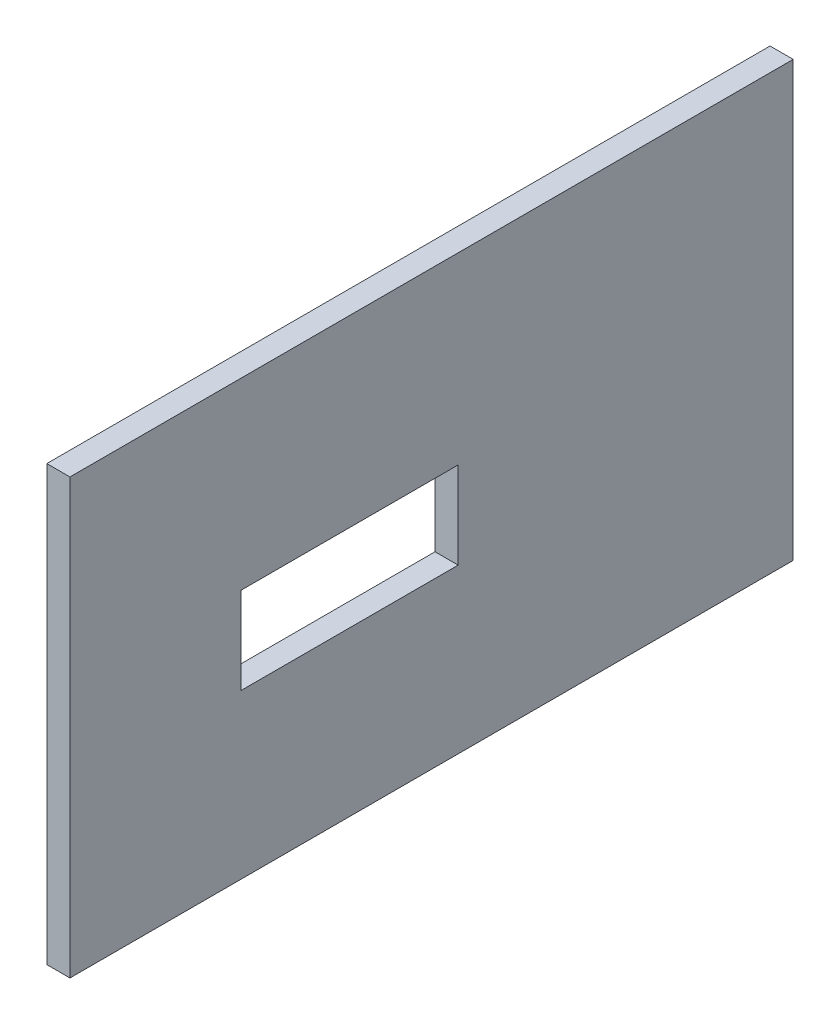
ISO-10303-21;
HEADER;
FILE_DESCRIPTION(('STEP AP214'),'2;1');
FILE_NAME('part.step','',(''),(''),'','','');
FILE_SCHEMA(('AUTOMOTIVE_DESIGN { 1 0 10303 214 1 1 1 1 }'));
ENDSEC;
DATA;
#1=APPLICATION_CONTEXT('core data for automotive mechanical design processes');
#2=APPLICATION_PROTOCOL_DEFINITION('international standard','automotive_design',2000,#1);
#3=PRODUCT_CONTEXT('',#1,'mechanical');
#4=PRODUCT('Part','Part','',(#3));
#5=PRODUCT_RELATED_PRODUCT_CATEGORY('part','',(#4));
#6=PRODUCT_DEFINITION_FORMATION('','',#4);
#7=PRODUCT_DEFINITION_CONTEXT('part definition',#1,'design');
#8=PRODUCT_DEFINITION('design','',#6,#7);
#9=PRODUCT_DEFINITION_SHAPE('','',#8);
#10=(LENGTH_UNIT() NAMED_UNIT(*) SI_UNIT(.MILLI.,.METRE.));
#11=(NAMED_UNIT(*) PLANE_ANGLE_UNIT() SI_UNIT($,.RADIAN.));
#12=(NAMED_UNIT(*) SI_UNIT($,.STERADIAN.) SOLID_ANGLE_UNIT());
#13=UNCERTAINTY_MEASURE_WITH_UNIT(LENGTH_MEASURE(1.E-05),#10,'distance_accuracy_value','');
#14=(GEOMETRIC_REPRESENTATION_CONTEXT(3) GLOBAL_UNCERTAINTY_ASSIGNED_CONTEXT((#13)) GLOBAL_UNIT_ASSIGNED_CONTEXT((#10,
#11,#12)) REPRESENTATION_CONTEXT('',''));
#15=CARTESIAN_POINT('',(0.,0.,0.));
#16=DIRECTION('',(0.,0.,1.));
#17=DIRECTION('',(1.,0.,0.));
#18=AXIS2_PLACEMENT_3D('',#15,#16,#17);
#19=CARTESIAN_POINT('',(3.2,37.4000000000006,1.06355163924267));
#20=DIRECTION('',(0.,0.,1.));
#21=DIRECTION('',(0.,-1.,0.));
#22=AXIS2_PLACEMENT_3D('',#19,#20,#21);
#23=PLANE('',#22);
#24=DIRECTION('',(0.,1.,0.));
#25=VECTOR('',#24,1.);
#26=CARTESIAN_POINT('',(0.,37.4000000000006,1.06355163924267));
#27=LINE('',#26,#25);
#28=CARTESIAN_POINT('',(0.,-22.5999999999994,1.06355163924265));
#29=VERTEX_POINT('',#28);
#30=CARTESIAN_POINT('',(0.,37.4000000000006,1.06355163924267));
#31=VERTEX_POINT('',#30);
#32=EDGE_CURVE('E133',#29,#31,#27,.T.);
#33=ORIENTED_EDGE('',*,*,#32,.T.);
#34=DIRECTION('',(-1.,0.,0.));
#35=VECTOR('',#34,1.);
#36=CARTESIAN_POINT('',(3.2,37.4000000000006,1.06355163924267));
#37=LINE('',#36,#35);
#38=CARTESIAN_POINT('',(3.2,37.4000000000006,1.06355163924267));
#39=VERTEX_POINT('',#38);
#40=EDGE_CURVE('E11',#39,#31,#37,.T.);
#41=ORIENTED_EDGE('',*,*,#40,.F.);
#42=DIRECTION('',(0.,1.,0.));
#43=VECTOR('',#42,1.);
#44=CARTESIAN_POINT('',(3.2,37.4000000000006,1.06355163924267));
#45=LINE('',#44,#43);
#46=CARTESIAN_POINT('',(3.2,-22.5999999999994,1.06355163924265));
#47=VERTEX_POINT('',#46);
#48=EDGE_CURVE('E137',#47,#39,#45,.T.);
#49=ORIENTED_EDGE('',*,*,#48,.F.);
#50=DIRECTION('',(-1.,0.,0.));
#51=VECTOR('',#50,1.);
#52=CARTESIAN_POINT('',(3.2,-22.5999999999994,1.06355163924265));
#53=LINE('',#52,#51);
#54=EDGE_CURVE('E147',#47,#29,#53,.T.);
#55=ORIENTED_EDGE('',*,*,#54,.T.);
#56=EDGE_LOOP('',(#33,#41,#49,#55));
#57=FACE_BOUND('',#56,.T.);
#58=ADVANCED_FACE('F36',(#57),#23,.F.);
#59=CARTESIAN_POINT('',(3.2,37.4000000000006,101.063551639243));
#60=DIRECTION('',(0.,-1.,0.));
#61=DIRECTION('',(0.,0.,-1.));
#62=AXIS2_PLACEMENT_3D('',#59,#60,#61);
#63=PLANE('',#62);
#64=DIRECTION('',(0.,0.,1.));
#65=VECTOR('',#64,1.);
#66=CARTESIAN_POINT('',(0.,37.4000000000006,101.063551639243));
#67=LINE('',#66,#65);
#68=CARTESIAN_POINT('',(0.,37.4000000000006,101.063551639243));
#69=VERTEX_POINT('',#68);
#70=EDGE_CURVE('E150',#31,#69,#67,.T.);
#71=ORIENTED_EDGE('',*,*,#70,.T.);
#72=DIRECTION('',(-1.,0.,0.));
#73=VECTOR('',#72,1.);
#74=CARTESIAN_POINT('',(3.2,37.4000000000006,101.063551639243));
#75=LINE('',#74,#73);
#76=CARTESIAN_POINT('',(3.2,37.4000000000006,101.063551639243));
#77=VERTEX_POINT('',#76);
#78=EDGE_CURVE('E43',#77,#69,#75,.T.);
#79=ORIENTED_EDGE('',*,*,#78,.F.);
#80=DIRECTION('',(0.,0.,1.));
#81=VECTOR('',#80,1.);
#82=CARTESIAN_POINT('',(3.2,37.4000000000006,101.063551639243));
#83=LINE('',#82,#81);
#84=EDGE_CURVE('E140',#39,#77,#83,.T.);
#85=ORIENTED_EDGE('',*,*,#84,.F.);
#86=ORIENTED_EDGE('',*,*,#40,.T.);
#87=EDGE_LOOP('',(#71,#79,#85,#86));
#88=FACE_BOUND('',#87,.T.);
#89=ADVANCED_FACE('F178',(#88),#63,.F.);
#90=CARTESIAN_POINT('',(3.2,37.4000000000006,101.063551639243));
#91=DIRECTION('',(0.,0.,-1.));
#92=DIRECTION('',(0.,1.,0.));
#93=AXIS2_PLACEMENT_3D('',#90,#91,#92);
#94=PLANE('',#93);
#95=DIRECTION('',(0.,-1.,0.));
#96=VECTOR('',#95,1.);
#97=CARTESIAN_POINT('',(0.,37.4000000000006,101.063551639243));
#98=LINE('',#97,#96);
#99=CARTESIAN_POINT('',(0.,-22.5999999999994,101.063551639243));
#100=VERTEX_POINT('',#99);
#101=EDGE_CURVE('E152',#69,#100,#98,.T.);
#102=ORIENTED_EDGE('',*,*,#101,.T.);
#103=DIRECTION('',(-1.,0.,0.));
#104=VECTOR('',#103,1.);
#105=CARTESIAN_POINT('',(3.2,-22.5999999999994,101.063551639243));
#106=LINE('',#105,#104);
#107=CARTESIAN_POINT('',(3.2,-22.5999999999994,101.063551639243));
#108=VERTEX_POINT('',#107);
#109=EDGE_CURVE('E157',#108,#100,#106,.T.);
#110=ORIENTED_EDGE('',*,*,#109,.F.);
#111=DIRECTION('',(0.,-1.,0.));
#112=VECTOR('',#111,1.);
#113=CARTESIAN_POINT('',(3.2,37.4000000000006,101.063551639243));
#114=LINE('',#113,#112);
#115=EDGE_CURVE('E143',#77,#108,#114,.T.);
#116=ORIENTED_EDGE('',*,*,#115,.F.);
#117=ORIENTED_EDGE('',*,*,#78,.T.);
#118=EDGE_LOOP('',(#102,#110,#116,#117));
#119=FACE_BOUND('',#118,.T.);
#120=ADVANCED_FACE('F164',(#119),#94,.F.);
#121=CARTESIAN_POINT('',(3.2,-22.5999999999994,101.063551639243));
#122=DIRECTION('',(0.,1.,0.));
#123=DIRECTION('',(0.,0.,1.));
#124=AXIS2_PLACEMENT_3D('',#121,#122,#123);
#125=PLANE('',#124);
#126=DIRECTION('',(0.,0.,-1.));
#127=VECTOR('',#126,1.);
#128=CARTESIAN_POINT('',(0.,-22.5999999999994,101.063551639243));
#129=LINE('',#128,#127);
#130=EDGE_CURVE('E141',#100,#29,#129,.T.);
#131=ORIENTED_EDGE('',*,*,#130,.T.);
#132=ORIENTED_EDGE('',*,*,#54,.F.);
#133=DIRECTION('',(0.,0.,-1.));
#134=VECTOR('',#133,1.);
#135=CARTESIAN_POINT('',(3.2,-22.5999999999994,101.063551639243));
#136=LINE('',#135,#134);
#137=EDGE_CURVE('E145',#108,#47,#136,.T.);
#138=ORIENTED_EDGE('',*,*,#137,.F.);
#139=ORIENTED_EDGE('',*,*,#109,.T.);
#140=EDGE_LOOP('',(#131,#132,#138,#139));
#141=FACE_BOUND('',#140,.T.);
#142=ADVANCED_FACE('F171',(#141),#125,.F.);
#143=CARTESIAN_POINT('',(3.2,0.,0.));
#144=DIRECTION('',(1.,0.,0.));
#145=DIRECTION('',(0.,0.,-1.));
#146=AXIS2_PLACEMENT_3D('',#143,#144,#145);
#147=PLANE('',#146);
#148=DIRECTION('',(0.,1.,0.));
#149=VECTOR('',#148,1.);
#150=CARTESIAN_POINT('',(3.2,12.,47.3877220991028));
#151=LINE('',#150,#149);
#152=CARTESIAN_POINT('',(3.2,0.,47.3877220991028));
#153=VERTEX_POINT('',#152);
#154=CARTESIAN_POINT('',(3.2,12.,47.3877220991028));
#155=VERTEX_POINT('',#154);
#156=EDGE_CURVE('E50',#153,#155,#151,.T.);
#157=ORIENTED_EDGE('',*,*,#156,.F.);
#158=DIRECTION('',(0.,0.,-1.));
#159=VECTOR('',#158,1.);
#160=CARTESIAN_POINT('',(3.2,0.,77.3877220991028));
#161=LINE('',#160,#159);
#162=CARTESIAN_POINT('',(3.2,0.,77.3877220991028));
#163=VERTEX_POINT('',#162);
#164=EDGE_CURVE('E118',#163,#153,#161,.T.);
#165=ORIENTED_EDGE('',*,*,#164,.F.);
#166=DIRECTION('',(0.,-1.,0.));
#167=VECTOR('',#166,1.);
#168=CARTESIAN_POINT('',(3.2,12.,77.3877220991028));
#169=LINE('',#168,#167);
#170=CARTESIAN_POINT('',(3.2,12.,77.3877220991028));
#171=VERTEX_POINT('',#170);
#172=EDGE_CURVE('E121',#171,#163,#169,.T.);
#173=ORIENTED_EDGE('',*,*,#172,.F.);
#174=DIRECTION('',(0.,0.,1.));
#175=VECTOR('',#174,1.);
#176=CARTESIAN_POINT('',(3.2,12.,77.3877220991028));
#177=LINE('',#176,#175);
#178=EDGE_CURVE('E127',#155,#171,#177,.T.);
#179=ORIENTED_EDGE('',*,*,#178,.F.);
#180=EDGE_LOOP('',(#157,#165,#173,#179));
#181=FACE_BOUND('',#180,.T.);
#182=ORIENTED_EDGE('',*,*,#48,.T.);
#183=ORIENTED_EDGE('',*,*,#84,.T.);
#184=ORIENTED_EDGE('',*,*,#115,.T.);
#185=ORIENTED_EDGE('',*,*,#137,.T.);
#186=EDGE_LOOP('',(#182,#183,#184,#185));
#187=FACE_BOUND('',#186,.T.);
#188=ADVANCED_FACE('F177',(#181,#187),#147,.T.);
#189=CARTESIAN_POINT('',(0.,0.,0.));
#190=DIRECTION('',(1.,0.,0.));
#191=DIRECTION('',(0.,0.,-1.));
#192=AXIS2_PLACEMENT_3D('',#189,#190,#191);
#193=PLANE('',#192);
#194=DIRECTION('',(0.,0.,-1.));
#195=VECTOR('',#194,1.);
#196=CARTESIAN_POINT('',(0.,0.,77.3877220991028));
#197=LINE('',#196,#195);
#198=CARTESIAN_POINT('',(0.,0.,77.3877220991028));
#199=VERTEX_POINT('',#198);
#200=CARTESIAN_POINT('',(0.,0.,47.3877220991028));
#201=VERTEX_POINT('',#200);
#202=EDGE_CURVE('E108',#199,#201,#197,.T.);
#203=ORIENTED_EDGE('',*,*,#202,.T.);
#204=DIRECTION('',(0.,1.,0.));
#205=VECTOR('',#204,1.);
#206=CARTESIAN_POINT('',(0.,12.,47.3877220991028));
#207=LINE('',#206,#205);
#208=CARTESIAN_POINT('',(0.,12.,47.3877220991028));
#209=VERTEX_POINT('',#208);
#210=EDGE_CURVE('E102',#201,#209,#207,.T.);
#211=ORIENTED_EDGE('',*,*,#210,.T.);
#212=DIRECTION('',(0.,0.,1.));
#213=VECTOR('',#212,1.);
#214=CARTESIAN_POINT('',(0.,12.,77.3877220991028));
#215=LINE('',#214,#213);
#216=CARTESIAN_POINT('',(0.,12.,77.3877220991028));
#217=VERTEX_POINT('',#216);
#218=EDGE_CURVE('E111',#209,#217,#215,.T.);
#219=ORIENTED_EDGE('',*,*,#218,.T.);
#220=DIRECTION('',(0.,-1.,0.));
#221=VECTOR('',#220,1.);
#222=CARTESIAN_POINT('',(0.,12.,77.3877220991028));
#223=LINE('',#222,#221);
#224=EDGE_CURVE('E58',#217,#199,#223,.T.);
#225=ORIENTED_EDGE('',*,*,#224,.T.);
#226=EDGE_LOOP('',(#203,#211,#219,#225));
#227=FACE_BOUND('',#226,.T.);
#228=ORIENTED_EDGE('',*,*,#32,.F.);
#229=ORIENTED_EDGE('',*,*,#130,.F.);
#230=ORIENTED_EDGE('',*,*,#101,.F.);
#231=ORIENTED_EDGE('',*,*,#70,.F.);
#232=EDGE_LOOP('',(#228,#229,#230,#231));
#233=FACE_BOUND('',#232,.T.);
#234=ADVANCED_FACE('F115',(#227,#233),#193,.F.);
#235=CARTESIAN_POINT('',(0.,12.,47.3877220991028));
#236=DIRECTION('',(0.,0.,-1.));
#237=DIRECTION('',(-1.,0.,0.));
#238=AXIS2_PLACEMENT_3D('',#235,#236,#237);
#239=PLANE('',#238);
#240=ORIENTED_EDGE('',*,*,#156,.T.);
#241=DIRECTION('',(1.,0.,0.));
#242=VECTOR('',#241,1.);
#243=CARTESIAN_POINT('',(0.,12.,47.3877220991028));
#244=LINE('',#243,#242);
#245=EDGE_CURVE('E98',#209,#155,#244,.T.);
#246=ORIENTED_EDGE('',*,*,#245,.F.);
#247=ORIENTED_EDGE('',*,*,#210,.F.);
#248=DIRECTION('',(1.,0.,0.));
#249=VECTOR('',#248,1.);
#250=CARTESIAN_POINT('',(0.,0.,47.3877220991028));
#251=LINE('',#250,#249);
#252=EDGE_CURVE('E131',#201,#153,#251,.T.);
#253=ORIENTED_EDGE('',*,*,#252,.T.);
#254=EDGE_LOOP('',(#240,#246,#247,#253));
#255=FACE_BOUND('',#254,.T.);
#256=ADVANCED_FACE('F100',(#255),#239,.F.);
#257=CARTESIAN_POINT('',(0.,0.,77.3877220991028));
#258=DIRECTION('',(0.,-1.,0.));
#259=DIRECTION('',(0.,0.,-1.));
#260=AXIS2_PLACEMENT_3D('',#257,#258,#259);
#261=PLANE('',#260);
#262=ORIENTED_EDGE('',*,*,#164,.T.);
#263=ORIENTED_EDGE('',*,*,#252,.F.);
#264=ORIENTED_EDGE('',*,*,#202,.F.);
#265=DIRECTION('',(1.,0.,0.));
#266=VECTOR('',#265,1.);
#267=CARTESIAN_POINT('',(0.,0.,77.3877220991028));
#268=LINE('',#267,#266);
#269=EDGE_CURVE('E134',#199,#163,#268,.T.);
#270=ORIENTED_EDGE('',*,*,#269,.T.);
#271=EDGE_LOOP('',(#262,#263,#264,#270));
#272=FACE_BOUND('',#271,.T.);
#273=ADVANCED_FACE('F195',(#272),#261,.F.);
#274=CARTESIAN_POINT('',(0.,12.,77.3877220991028));
#275=DIRECTION('',(0.,0.,1.));
#276=DIRECTION('',(1.,0.,0.));
#277=AXIS2_PLACEMENT_3D('',#274,#275,#276);
#278=PLANE('',#277);
#279=ORIENTED_EDGE('',*,*,#172,.T.);
#280=ORIENTED_EDGE('',*,*,#269,.F.);
#281=ORIENTED_EDGE('',*,*,#224,.F.);
#282=DIRECTION('',(1.,0.,0.));
#283=VECTOR('',#282,1.);
#284=CARTESIAN_POINT('',(0.,12.,77.3877220991028));
#285=LINE('',#284,#283);
#286=EDGE_CURVE('E107',#217,#171,#285,.T.);
#287=ORIENTED_EDGE('',*,*,#286,.T.);
#288=EDGE_LOOP('',(#279,#280,#281,#287));
#289=FACE_BOUND('',#288,.T.);
#290=ADVANCED_FACE('F198',(#289),#278,.F.);
#291=CARTESIAN_POINT('',(0.,12.,77.3877220991028));
#292=DIRECTION('',(0.,1.,0.));
#293=DIRECTION('',(0.,0.,1.));
#294=AXIS2_PLACEMENT_3D('',#291,#292,#293);
#295=PLANE('',#294);
#296=ORIENTED_EDGE('',*,*,#178,.T.);
#297=ORIENTED_EDGE('',*,*,#286,.F.);
#298=ORIENTED_EDGE('',*,*,#218,.F.);
#299=ORIENTED_EDGE('',*,*,#245,.T.);
#300=EDGE_LOOP('',(#296,#297,#298,#299));
#301=FACE_BOUND('',#300,.T.);
#302=ADVANCED_FACE('F112',(#301),#295,.F.);
#303=CLOSED_SHELL('',(#58,#89,#120,#142,#188,#234,#256,#273,#290,#302));
#304=MANIFOLD_SOLID_BREP('B2',#303);
#305=ADVANCED_BREP_SHAPE_REPRESENTATION('',(#18,#304),#14);
#306=SHAPE_DEFINITION_REPRESENTATION(#9,#305);
ENDSEC;
END-ISO-10303-21;
